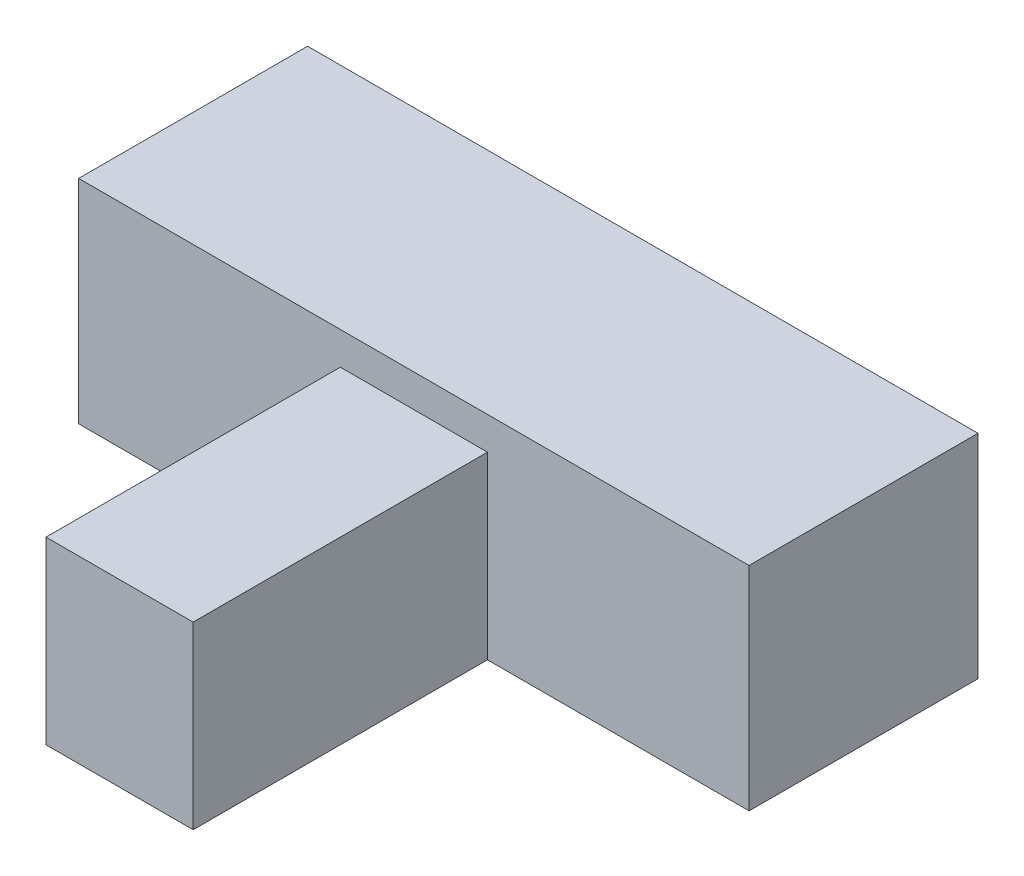
ISO-10303-21;
HEADER;
FILE_DESCRIPTION(('STEP AP214'),'2;1');
FILE_NAME('part.step','',(''),(''),'','','');
FILE_SCHEMA(('AUTOMOTIVE_DESIGN { 1 0 10303 214 1 1 1 1 }'));
ENDSEC;
DATA;
#1=APPLICATION_CONTEXT('core data for automotive mechanical design processes');
#2=APPLICATION_PROTOCOL_DEFINITION('international standard','automotive_design',2000,#1);
#3=PRODUCT_CONTEXT('',#1,'mechanical');
#4=PRODUCT('Part','Part','',(#3));
#5=PRODUCT_RELATED_PRODUCT_CATEGORY('part','',(#4));
#6=PRODUCT_DEFINITION_FORMATION('','',#4);
#7=PRODUCT_DEFINITION_CONTEXT('part definition',#1,'design');
#8=PRODUCT_DEFINITION('design','',#6,#7);
#9=PRODUCT_DEFINITION_SHAPE('','',#8);
#10=(LENGTH_UNIT() NAMED_UNIT(*) SI_UNIT(.MILLI.,.METRE.));
#11=(NAMED_UNIT(*) PLANE_ANGLE_UNIT() SI_UNIT($,.RADIAN.));
#12=(NAMED_UNIT(*) SI_UNIT($,.STERADIAN.) SOLID_ANGLE_UNIT());
#13=UNCERTAINTY_MEASURE_WITH_UNIT(LENGTH_MEASURE(1.E-05),#10,'distance_accuracy_value','');
#14=(GEOMETRIC_REPRESENTATION_CONTEXT(3) GLOBAL_UNCERTAINTY_ASSIGNED_CONTEXT((#13)) GLOBAL_UNIT_ASSIGNED_CONTEXT((#10,
#11,#12)) REPRESENTATION_CONTEXT('',''));
#15=CARTESIAN_POINT('',(0.,0.,0.));
#16=DIRECTION('',(0.,0.,1.));
#17=DIRECTION('',(1.,0.,0.));
#18=AXIS2_PLACEMENT_3D('',#15,#16,#17);
#19=CARTESIAN_POINT('',(125.,80.,75.));
#20=DIRECTION('',(1.,0.,0.));
#21=DIRECTION('',(0.,1.,0.));
#22=AXIS2_PLACEMENT_3D('',#19,#20,#21);
#23=PLANE('',#22);
#24=DIRECTION('',(0.,-1.,0.));
#25=VECTOR('',#24,1.);
#26=CARTESIAN_POINT('',(125.,80.,5.));
#27=LINE('',#26,#25);
#28=CARTESIAN_POINT('',(125.,65.,5.));
#29=VERTEX_POINT('',#28);
#30=CARTESIAN_POINT('',(125.,0.,5.));
#31=VERTEX_POINT('',#30);
#32=EDGE_CURVE('E124',#29,#31,#27,.T.);
#33=ORIENTED_EDGE('',*,*,#32,.F.);
#34=DIRECTION('',(0.,0.,-1.));
#35=VECTOR('',#34,1.);
#36=CARTESIAN_POINT('',(125.,65.,75.));
#37=LINE('',#36,#35);
#38=CARTESIAN_POINT('',(125.,65.,75.));
#39=VERTEX_POINT('',#38);
#40=EDGE_CURVE('E60',#39,#29,#37,.T.);
#41=ORIENTED_EDGE('',*,*,#40,.F.);
#42=DIRECTION('',(0.,-1.,0.));
#43=VECTOR('',#42,1.);
#44=CARTESIAN_POINT('',(125.,80.,75.));
#45=LINE('',#44,#43);
#46=CARTESIAN_POINT('',(125.,0.,75.));
#47=VERTEX_POINT('',#46);
#48=EDGE_CURVE('E122',#39,#47,#45,.T.);
#49=ORIENTED_EDGE('',*,*,#48,.T.);
#50=DIRECTION('',(0.,0.,-1.));
#51=VECTOR('',#50,1.);
#52=CARTESIAN_POINT('',(125.,0.,75.));
#53=LINE('',#52,#51);
#54=EDGE_CURVE('E139',#47,#31,#53,.T.);
#55=ORIENTED_EDGE('',*,*,#54,.T.);
#56=EDGE_LOOP('',(#33,#41,#49,#55));
#57=FACE_BOUND('',#56,.T.);
#58=ADVANCED_FACE('F44',(#57),#23,.T.);
#59=CARTESIAN_POINT('',(-80.,0.,75.));
#60=DIRECTION('',(-1.,0.,0.));
#61=DIRECTION('',(0.,0.,1.));
#62=AXIS2_PLACEMENT_3D('',#59,#60,#61);
#63=PLANE('',#62);
#64=DIRECTION('',(0.,1.,0.));
#65=VECTOR('',#64,1.);
#66=CARTESIAN_POINT('',(-80.,0.,75.));
#67=LINE('',#66,#65);
#68=CARTESIAN_POINT('',(-80.,0.,75.));
#69=VERTEX_POINT('',#68);
#70=CARTESIAN_POINT('',(-80.,65.,75.));
#71=VERTEX_POINT('',#70);
#72=EDGE_CURVE('E134',#69,#71,#67,.T.);
#73=ORIENTED_EDGE('',*,*,#72,.T.);
#74=DIRECTION('',(0.,0.,1.));
#75=VECTOR('',#74,1.);
#76=CARTESIAN_POINT('',(-80.,65.,5.));
#77=LINE('',#76,#75);
#78=CARTESIAN_POINT('',(-80.,65.,5.));
#79=VERTEX_POINT('',#78);
#80=EDGE_CURVE('E112',#79,#71,#77,.T.);
#81=ORIENTED_EDGE('',*,*,#80,.F.);
#82=DIRECTION('',(0.,1.,0.));
#83=VECTOR('',#82,1.);
#84=CARTESIAN_POINT('',(-80.,0.,5.));
#85=LINE('',#84,#83);
#86=CARTESIAN_POINT('',(-80.,0.,5.));
#87=VERTEX_POINT('',#86);
#88=EDGE_CURVE('E199',#87,#79,#85,.T.);
#89=ORIENTED_EDGE('',*,*,#88,.F.);
#90=DIRECTION('',(0.,0.,-1.));
#91=VECTOR('',#90,1.);
#92=CARTESIAN_POINT('',(-80.,0.,75.));
#93=LINE('',#92,#91);
#94=EDGE_CURVE('E133',#69,#87,#93,.T.);
#95=ORIENTED_EDGE('',*,*,#94,.F.);
#96=EDGE_LOOP('',(#73,#81,#89,#95));
#97=FACE_BOUND('',#96,.T.);
#98=ADVANCED_FACE('F211',(#97),#63,.T.);
#99=CARTESIAN_POINT('',(0.,0.,75.));
#100=DIRECTION('',(0.,0.,-1.));
#101=DIRECTION('',(-1.,0.,0.));
#102=AXIS2_PLACEMENT_3D('',#99,#100,#101);
#103=PLANE('',#102);
#104=DIRECTION('',(1.,0.,0.));
#105=VECTOR('',#104,1.);
#106=CARTESIAN_POINT('',(-80.,65.,75.));
#107=LINE('',#106,#105);
#108=EDGE_CURVE('E109',#71,#39,#107,.T.);
#109=ORIENTED_EDGE('',*,*,#108,.F.);
#110=ORIENTED_EDGE('',*,*,#72,.F.);
#111=DIRECTION('',(-1.,0.,0.));
#112=VECTOR('',#111,1.);
#113=CARTESIAN_POINT('',(0.,0.,75.));
#114=LINE('',#113,#112);
#115=CARTESIAN_POINT('',(0.,0.,75.));
#116=VERTEX_POINT('',#115);
#117=EDGE_CURVE('E197',#116,#69,#114,.T.);
#118=ORIENTED_EDGE('',*,*,#117,.F.);
#119=DIRECTION('',(0.,-1.,0.));
#120=VECTOR('',#119,1.);
#121=CARTESIAN_POINT('',(0.,0.,75.));
#122=LINE('',#121,#120);
#123=CARTESIAN_POINT('',(0.,54.9999999999997,75.));
#124=VERTEX_POINT('',#123);
#125=EDGE_CURVE('E149',#124,#116,#122,.T.);
#126=ORIENTED_EDGE('',*,*,#125,.F.);
#127=DIRECTION('',(-1.,0.,0.));
#128=VECTOR('',#127,1.);
#129=CARTESIAN_POINT('',(0.,54.9999999999997,75.));
#130=LINE('',#129,#128);
#131=CARTESIAN_POINT('',(45.,55.,75.));
#132=VERTEX_POINT('',#131);
#133=EDGE_CURVE('E11',#132,#124,#130,.T.);
#134=ORIENTED_EDGE('',*,*,#133,.F.);
#135=DIRECTION('',(0.,-1.,0.));
#136=VECTOR('',#135,1.);
#137=CARTESIAN_POINT('',(45.,0.,75.));
#138=LINE('',#137,#136);
#139=CARTESIAN_POINT('',(45.,0.,75.));
#140=VERTEX_POINT('',#139);
#141=EDGE_CURVE('E145',#132,#140,#138,.T.);
#142=ORIENTED_EDGE('',*,*,#141,.T.);
#143=EDGE_CURVE('E130',#47,#140,#114,.T.);
#144=ORIENTED_EDGE('',*,*,#143,.F.);
#145=ORIENTED_EDGE('',*,*,#48,.F.);
#146=EDGE_LOOP('',(#109,#110,#118,#126,#134,#142,#144,#145));
#147=FACE_BOUND('',#146,.T.);
#148=ADVANCED_FACE('F128',(#147),#103,.F.);
#149=CARTESIAN_POINT('',(0.,0.,5.));
#150=DIRECTION('',(0.,0.,-1.));
#151=DIRECTION('',(-1.,0.,0.));
#152=AXIS2_PLACEMENT_3D('',#149,#150,#151);
#153=PLANE('',#152);
#154=ORIENTED_EDGE('',*,*,#88,.T.);
#155=DIRECTION('',(-1.,0.,0.));
#156=VECTOR('',#155,1.);
#157=CARTESIAN_POINT('',(125.,65.,5.));
#158=LINE('',#157,#156);
#159=EDGE_CURVE('E126',#29,#79,#158,.T.);
#160=ORIENTED_EDGE('',*,*,#159,.F.);
#161=ORIENTED_EDGE('',*,*,#32,.T.);
#162=DIRECTION('',(-1.,0.,0.));
#163=VECTOR('',#162,1.);
#164=CARTESIAN_POINT('',(125.,0.,5.));
#165=LINE('',#164,#163);
#166=EDGE_CURVE('E68',#31,#87,#165,.T.);
#167=ORIENTED_EDGE('',*,*,#166,.T.);
#168=EDGE_LOOP('',(#154,#160,#161,#167));
#169=FACE_BOUND('',#168,.T.);
#170=ADVANCED_FACE('F213',(#169),#153,.T.);
#171=CARTESIAN_POINT('',(0.,0.,165.));
#172=DIRECTION('',(0.,1.,0.));
#173=DIRECTION('',(0.,0.,1.));
#174=AXIS2_PLACEMENT_3D('',#171,#172,#173);
#175=PLANE('',#174);
#176=ORIENTED_EDGE('',*,*,#166,.F.);
#177=ORIENTED_EDGE('',*,*,#54,.F.);
#178=ORIENTED_EDGE('',*,*,#143,.T.);
#179=DIRECTION('',(0.,0.,-1.));
#180=VECTOR('',#179,1.);
#181=CARTESIAN_POINT('',(45.,0.,165.));
#182=LINE('',#181,#180);
#183=CARTESIAN_POINT('',(45.,0.,165.));
#184=VERTEX_POINT('',#183);
#185=EDGE_CURVE('E171',#184,#140,#182,.T.);
#186=ORIENTED_EDGE('',*,*,#185,.F.);
#187=DIRECTION('',(1.,0.,0.));
#188=VECTOR('',#187,1.);
#189=CARTESIAN_POINT('',(0.,0.,165.));
#190=LINE('',#189,#188);
#191=CARTESIAN_POINT('',(0.,0.,165.));
#192=VERTEX_POINT('',#191);
#193=EDGE_CURVE('E164',#192,#184,#190,.T.);
#194=ORIENTED_EDGE('',*,*,#193,.F.);
#195=DIRECTION('',(0.,0.,-1.));
#196=VECTOR('',#195,1.);
#197=CARTESIAN_POINT('',(0.,0.,165.));
#198=LINE('',#197,#196);
#199=EDGE_CURVE('E53',#192,#116,#198,.T.);
#200=ORIENTED_EDGE('',*,*,#199,.T.);
#201=ORIENTED_EDGE('',*,*,#117,.T.);
#202=ORIENTED_EDGE('',*,*,#94,.T.);
#203=EDGE_LOOP('',(#176,#177,#178,#186,#194,#200,#201,#202));
#204=FACE_BOUND('',#203,.T.);
#205=ADVANCED_FACE('F195',(#204),#175,.F.);
#206=CARTESIAN_POINT('',(0.,0.,165.));
#207=DIRECTION('',(-1.,0.,0.));
#208=DIRECTION('',(0.,0.,1.));
#209=AXIS2_PLACEMENT_3D('',#206,#207,#208);
#210=PLANE('',#209);
#211=DIRECTION('',(0.,0.,-1.));
#212=VECTOR('',#211,1.);
#213=CARTESIAN_POINT('',(0.,54.9999999999997,165.));
#214=LINE('',#213,#212);
#215=CARTESIAN_POINT('',(0.,54.9999999999997,165.));
#216=VERTEX_POINT('',#215);
#217=EDGE_CURVE('E167',#216,#124,#214,.T.);
#218=ORIENTED_EDGE('',*,*,#217,.T.);
#219=ORIENTED_EDGE('',*,*,#125,.T.);
#220=ORIENTED_EDGE('',*,*,#199,.F.);
#221=DIRECTION('',(0.,1.,0.));
#222=VECTOR('',#221,1.);
#223=CARTESIAN_POINT('',(0.,0.,165.));
#224=LINE('',#223,#222);
#225=EDGE_CURVE('E153',#192,#216,#224,.T.);
#226=ORIENTED_EDGE('',*,*,#225,.T.);
#227=EDGE_LOOP('',(#218,#219,#220,#226));
#228=FACE_BOUND('',#227,.T.);
#229=ADVANCED_FACE('F46',(#228),#210,.T.);
#230=CARTESIAN_POINT('',(45.,0.,165.));
#231=DIRECTION('',(-1.,0.,0.));
#232=DIRECTION('',(0.,0.,1.));
#233=AXIS2_PLACEMENT_3D('',#230,#231,#232);
#234=PLANE('',#233);
#235=ORIENTED_EDGE('',*,*,#141,.F.);
#236=DIRECTION('',(0.,0.,-1.));
#237=VECTOR('',#236,1.);
#238=CARTESIAN_POINT('',(45.,55.,165.));
#239=LINE('',#238,#237);
#240=CARTESIAN_POINT('',(45.,55.,165.));
#241=VERTEX_POINT('',#240);
#242=EDGE_CURVE('E175',#241,#132,#239,.T.);
#243=ORIENTED_EDGE('',*,*,#242,.F.);
#244=DIRECTION('',(0.,1.,0.));
#245=VECTOR('',#244,1.);
#246=CARTESIAN_POINT('',(45.,0.,165.));
#247=LINE('',#246,#245);
#248=EDGE_CURVE('E161',#184,#241,#247,.T.);
#249=ORIENTED_EDGE('',*,*,#248,.F.);
#250=ORIENTED_EDGE('',*,*,#185,.T.);
#251=EDGE_LOOP('',(#235,#243,#249,#250));
#252=FACE_BOUND('',#251,.T.);
#253=ADVANCED_FACE('F193',(#252),#234,.F.);
#254=CARTESIAN_POINT('',(0.,54.9999999999997,165.));
#255=DIRECTION('',(0.,1.,0.));
#256=DIRECTION('',(-1.,0.,0.));
#257=AXIS2_PLACEMENT_3D('',#254,#255,#256);
#258=PLANE('',#257);
#259=ORIENTED_EDGE('',*,*,#242,.T.);
#260=ORIENTED_EDGE('',*,*,#133,.T.);
#261=ORIENTED_EDGE('',*,*,#217,.F.);
#262=DIRECTION('',(1.,0.,0.));
#263=VECTOR('',#262,1.);
#264=CARTESIAN_POINT('',(0.,54.9999999999997,165.));
#265=LINE('',#264,#263);
#266=EDGE_CURVE('E157',#216,#241,#265,.T.);
#267=ORIENTED_EDGE('',*,*,#266,.T.);
#268=EDGE_LOOP('',(#259,#260,#261,#267));
#269=FACE_BOUND('',#268,.T.);
#270=ADVANCED_FACE('F184',(#269),#258,.T.);
#271=CARTESIAN_POINT('',(0.,0.,165.));
#272=DIRECTION('',(0.,0.,-1.));
#273=DIRECTION('',(-1.,0.,0.));
#274=AXIS2_PLACEMENT_3D('',#271,#272,#273);
#275=PLANE('',#274);
#276=ORIENTED_EDGE('',*,*,#225,.F.);
#277=ORIENTED_EDGE('',*,*,#193,.T.);
#278=ORIENTED_EDGE('',*,*,#248,.T.);
#279=ORIENTED_EDGE('',*,*,#266,.F.);
#280=EDGE_LOOP('',(#276,#277,#278,#279));
#281=FACE_BOUND('',#280,.T.);
#282=ADVANCED_FACE('F186',(#281),#275,.F.);
#283=CARTESIAN_POINT('',(0.,65.,0.));
#284=DIRECTION('',(0.,1.,0.));
#285=DIRECTION('',(-1.,0.,0.));
#286=AXIS2_PLACEMENT_3D('',#283,#284,#285);
#287=PLANE('',#286);
#288=ORIENTED_EDGE('',*,*,#108,.T.);
#289=ORIENTED_EDGE('',*,*,#40,.T.);
#290=ORIENTED_EDGE('',*,*,#159,.T.);
#291=ORIENTED_EDGE('',*,*,#80,.T.);
#292=EDGE_LOOP('',(#288,#289,#290,#291));
#293=FACE_BOUND('',#292,.T.);
#294=ADVANCED_FACE('F110',(#293),#287,.T.);
#295=CLOSED_SHELL('',(#58,#98,#148,#170,#205,#229,#253,#270,#282,#294));
#296=MANIFOLD_SOLID_BREP('B2',#295);
#297=ADVANCED_BREP_SHAPE_REPRESENTATION('',(#18,#296),#14);
#298=SHAPE_DEFINITION_REPRESENTATION(#9,#297);
ENDSEC;
END-ISO-10303-21;
